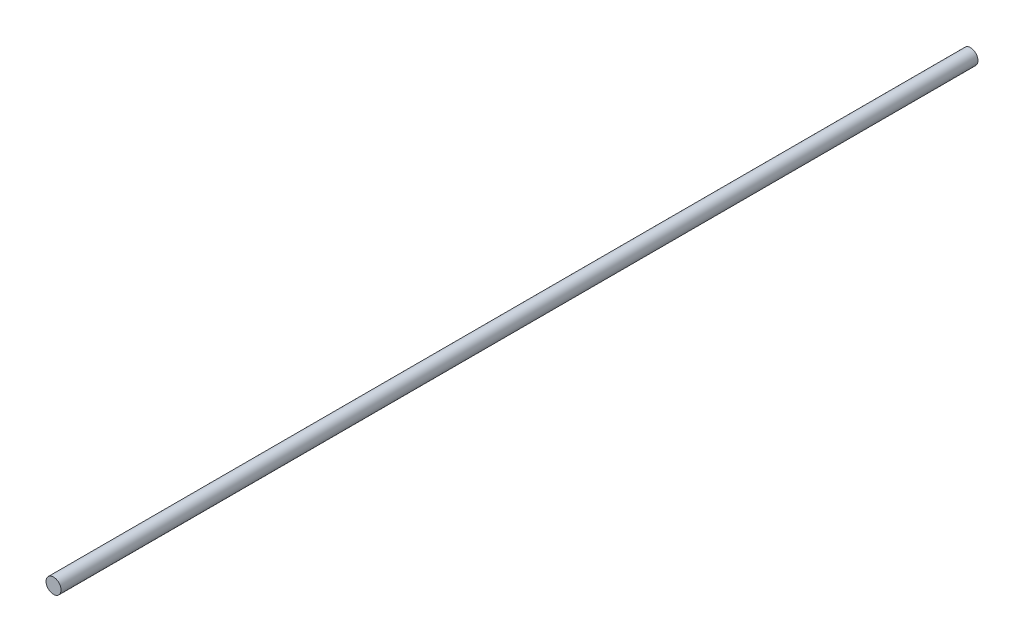
ISO-10303-21;
HEADER;
FILE_DESCRIPTION(('STEP AP214'),'2;1');
FILE_NAME('part.step','',(''),(''),'','','');
FILE_SCHEMA(('AUTOMOTIVE_DESIGN { 1 0 10303 214 1 1 1 1 }'));
ENDSEC;
DATA;
#1=APPLICATION_CONTEXT('core data for automotive mechanical design processes');
#2=APPLICATION_PROTOCOL_DEFINITION('international standard','automotive_design',2000,#1);
#3=PRODUCT_CONTEXT('',#1,'mechanical');
#4=PRODUCT('Part','Part','',(#3));
#5=PRODUCT_RELATED_PRODUCT_CATEGORY('part','',(#4));
#6=PRODUCT_DEFINITION_FORMATION('','',#4);
#7=PRODUCT_DEFINITION_CONTEXT('part definition',#1,'design');
#8=PRODUCT_DEFINITION('design','',#6,#7);
#9=PRODUCT_DEFINITION_SHAPE('','',#8);
#10=(LENGTH_UNIT() NAMED_UNIT(*) SI_UNIT(.MILLI.,.METRE.));
#11=(NAMED_UNIT(*) PLANE_ANGLE_UNIT() SI_UNIT($,.RADIAN.));
#12=(NAMED_UNIT(*) SI_UNIT($,.STERADIAN.) SOLID_ANGLE_UNIT());
#13=UNCERTAINTY_MEASURE_WITH_UNIT(LENGTH_MEASURE(1.E-05),#10,'distance_accuracy_value','');
#14=(GEOMETRIC_REPRESENTATION_CONTEXT(3) GLOBAL_UNCERTAINTY_ASSIGNED_CONTEXT((#13)) GLOBAL_UNIT_ASSIGNED_CONTEXT((#10,
#11,#12)) REPRESENTATION_CONTEXT('',''));
#15=CARTESIAN_POINT('',(0.,0.,0.));
#16=DIRECTION('',(0.,0.,1.));
#17=DIRECTION('',(1.,0.,0.));
#18=AXIS2_PLACEMENT_3D('',#15,#16,#17);
#19=CARTESIAN_POINT('',(0.,0.,1219.2));
#20=DIRECTION('',(0.,0.,-1.));
#21=DIRECTION('',(-1.,0.,0.));
#22=AXIS2_PLACEMENT_3D('',#19,#20,#21);
#23=CYLINDRICAL_SURFACE('',#22,10.);
#24=CARTESIAN_POINT('',(0.,0.,1219.2));
#25=DIRECTION('',(0.,0.,1.));
#26=DIRECTION('',(1.,0.,0.));
#27=AXIS2_PLACEMENT_3D('',#24,#25,#26);
#28=CIRCLE('',#27,10.);
#29=CARTESIAN_POINT('',(-10.,0.,1219.2));
#30=VERTEX_POINT('',#29);
#31=EDGE_CURVE('E10',#30,#30,#28,.T.);
#32=CARTESIAN_POINT('',(0.,0.,0.));
#33=DIRECTION('',(0.,0.,1.));
#34=DIRECTION('',(1.,0.,0.));
#35=AXIS2_PLACEMENT_3D('',#32,#33,#34);
#36=CIRCLE('',#35,10.);
#37=CARTESIAN_POINT('',(-10.,0.,0.));
#38=VERTEX_POINT('',#37);
#39=EDGE_CURVE('E38',#38,#38,#36,.T.);
#40=CARTESIAN_POINT('',(-10.,0.,1219.2));
#41=CARTESIAN_POINT('',(-10.,0.,1206.5));
#42=CARTESIAN_POINT('',(-10.,0.,1193.8));
#43=CARTESIAN_POINT('',(-10.,0.,1168.4));
#44=CARTESIAN_POINT('',(-10.,0.,1155.7));
#45=CARTESIAN_POINT('',(-10.,0.,1130.3));
#46=CARTESIAN_POINT('',(-10.,0.,1117.6));
#47=CARTESIAN_POINT('',(-10.,0.,1092.2));
#48=CARTESIAN_POINT('',(-10.,0.,1079.5));
#49=CARTESIAN_POINT('',(-10.,0.,1054.1));
#50=CARTESIAN_POINT('',(-10.,0.,1041.4));
#51=CARTESIAN_POINT('',(-10.,0.,1016.));
#52=CARTESIAN_POINT('',(-10.,0.,1003.3));
#53=CARTESIAN_POINT('',(-10.,0.,977.9));
#54=CARTESIAN_POINT('',(-10.,0.,965.2));
#55=CARTESIAN_POINT('',(-10.,0.,939.8));
#56=CARTESIAN_POINT('',(-10.,0.,927.1));
#57=CARTESIAN_POINT('',(-10.,0.,901.7));
#58=CARTESIAN_POINT('',(-10.,0.,889.));
#59=CARTESIAN_POINT('',(-10.,0.,863.6));
#60=CARTESIAN_POINT('',(-10.,0.,850.9));
#61=CARTESIAN_POINT('',(-10.,0.,825.5));
#62=CARTESIAN_POINT('',(-10.,0.,812.8));
#63=CARTESIAN_POINT('',(-10.,0.,787.4));
#64=CARTESIAN_POINT('',(-10.,0.,774.7));
#65=CARTESIAN_POINT('',(-10.,0.,749.3));
#66=CARTESIAN_POINT('',(-10.,0.,736.6));
#67=CARTESIAN_POINT('',(-10.,0.,711.2));
#68=CARTESIAN_POINT('',(-10.,0.,698.5));
#69=CARTESIAN_POINT('',(-10.,0.,673.1));
#70=CARTESIAN_POINT('',(-10.,0.,660.4));
#71=CARTESIAN_POINT('',(-10.,0.,635.));
#72=CARTESIAN_POINT('',(-10.,0.,622.3));
#73=CARTESIAN_POINT('',(-10.,0.,596.9));
#74=CARTESIAN_POINT('',(-10.,0.,584.2));
#75=CARTESIAN_POINT('',(-10.,0.,558.8));
#76=CARTESIAN_POINT('',(-10.,0.,546.1));
#77=CARTESIAN_POINT('',(-10.,0.,520.7));
#78=CARTESIAN_POINT('',(-10.,0.,508.));
#79=CARTESIAN_POINT('',(-10.,0.,482.6));
#80=CARTESIAN_POINT('',(-10.,0.,469.9));
#81=CARTESIAN_POINT('',(-10.,0.,444.5));
#82=CARTESIAN_POINT('',(-10.,0.,431.8));
#83=CARTESIAN_POINT('',(-10.,0.,406.4));
#84=CARTESIAN_POINT('',(-10.,0.,393.7));
#85=CARTESIAN_POINT('',(-10.,0.,368.3));
#86=CARTESIAN_POINT('',(-10.,0.,355.6));
#87=CARTESIAN_POINT('',(-10.,0.,330.2));
#88=CARTESIAN_POINT('',(-10.,0.,317.5));
#89=CARTESIAN_POINT('',(-10.,0.,292.1));
#90=CARTESIAN_POINT('',(-10.,0.,279.4));
#91=CARTESIAN_POINT('',(-10.,0.,254.));
#92=CARTESIAN_POINT('',(-10.,0.,241.3));
#93=CARTESIAN_POINT('',(-10.,0.,215.9));
#94=CARTESIAN_POINT('',(-10.,0.,203.2));
#95=CARTESIAN_POINT('',(-10.,0.,177.8));
#96=CARTESIAN_POINT('',(-10.,0.,165.1));
#97=CARTESIAN_POINT('',(-10.,0.,139.7));
#98=CARTESIAN_POINT('',(-10.,0.,127.));
#99=CARTESIAN_POINT('',(-10.,0.,101.6));
#100=CARTESIAN_POINT('',(-10.,0.,88.9));
#101=CARTESIAN_POINT('',(-10.,0.,63.5));
#102=CARTESIAN_POINT('',(-10.,0.,50.8));
#103=CARTESIAN_POINT('',(-10.,0.,25.4));
#104=CARTESIAN_POINT('',(-10.,0.,12.7));
#105=CARTESIAN_POINT('',(-10.,0.,0.));
#106=B_SPLINE_CURVE_WITH_KNOTS('',3,(#40,#41,#42,#43,#44,#45,#46,#47,#48,#49,#50,#51,#52,#53,
#54,#55,#56,#57,#58,#59,#60,#61,#62,#63,#64,#65,#66,#67,#68,#69,#70,#71,#72,#73,#74,#75,#76,#77,
#78,#79,#80,#81,#82,#83,#84,#85,#86,#87,#88,#89,#90,#91,#92,#93,#94,#95,#96,#97,#98,#99,#100,
#101,#102,#103,#104,#105),.UNSPECIFIED.,.F.,.F.,(4,2,2,2,2,2,2,2,2,2,2,2,2,2,2,2,2,2,2,2,2,2,2,
2,2,2,2,2,2,2,2,2,4),(0.,38.0999999999998,76.1999999999998,114.3,152.4,190.5,228.6,266.7,304.8,
342.9,381.,419.1,457.2,495.3,533.4,571.5,609.6,647.7,685.8,723.9,762.,800.1,838.2,876.3,914.4,
952.5,990.6,1028.7,1066.8,1104.9,1143.,1181.1,1219.2),.UNSPECIFIED.);
#107=EDGE_CURVE('BSEAM35',#30,#38,#106,.T.);
#108=ORIENTED_EDGE('',*,*,#31,.F.);
#109=ORIENTED_EDGE('',*,*,#39,.T.);
#110=ORIENTED_EDGE('',*,*,#107,.T.);
#111=ORIENTED_EDGE('',*,*,#107,.F.);
#112=EDGE_LOOP('',(#108,#110,#109,#111));
#113=FACE_BOUND('',#112,.T.);
#114=ADVANCED_FACE('F35',(#113),#23,.T.);
#115=CARTESIAN_POINT('',(0.,0.,1219.2));
#116=DIRECTION('',(0.,0.,1.));
#117=DIRECTION('',(1.,0.,0.));
#118=AXIS2_PLACEMENT_3D('',#115,#116,#117);
#119=PLANE('',#118);
#120=ORIENTED_EDGE('',*,*,#31,.T.);
#121=EDGE_LOOP('',(#120));
#122=FACE_BOUND('',#121,.T.);
#123=ADVANCED_FACE('F50',(#122),#119,.T.);
#124=CARTESIAN_POINT('',(0.,0.,0.));
#125=DIRECTION('',(0.,0.,1.));
#126=DIRECTION('',(1.,0.,0.));
#127=AXIS2_PLACEMENT_3D('',#124,#125,#126);
#128=PLANE('',#127);
#129=ORIENTED_EDGE('',*,*,#39,.F.);
#130=EDGE_LOOP('',(#129));
#131=FACE_BOUND('',#130,.T.);
#132=ADVANCED_FACE('F48',(#131),#128,.F.);
#133=CLOSED_SHELL('',(#114,#123,#132));
#134=MANIFOLD_SOLID_BREP('B2',#133);
#135=ADVANCED_BREP_SHAPE_REPRESENTATION('',(#18,#134),#14);
#136=SHAPE_DEFINITION_REPRESENTATION(#9,#135);
ENDSEC;
END-ISO-10303-21;
